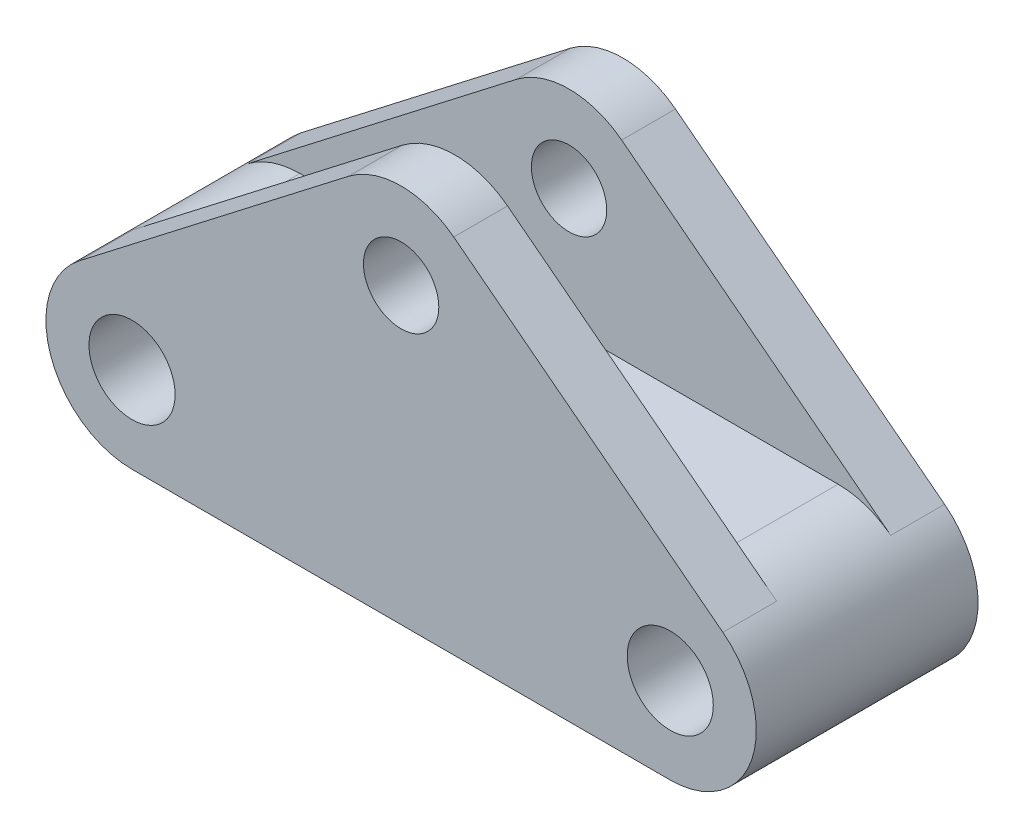
ISO-10303-21;
HEADER;
FILE_DESCRIPTION(('STEP AP214'),'2;1');
FILE_NAME('part.step','',(''),(''),'','','');
FILE_SCHEMA(('AUTOMOTIVE_DESIGN { 1 0 10303 214 1 1 1 1 }'));
ENDSEC;
DATA;
#1=APPLICATION_CONTEXT('core data for automotive mechanical design processes');
#2=APPLICATION_PROTOCOL_DEFINITION('international standard','automotive_design',2000,#1);
#3=PRODUCT_CONTEXT('',#1,'mechanical');
#4=PRODUCT('Part','Part','',(#3));
#5=PRODUCT_RELATED_PRODUCT_CATEGORY('part','',(#4));
#6=PRODUCT_DEFINITION_FORMATION('','',#4);
#7=PRODUCT_DEFINITION_CONTEXT('part definition',#1,'design');
#8=PRODUCT_DEFINITION('design','',#6,#7);
#9=PRODUCT_DEFINITION_SHAPE('','',#8);
#10=(LENGTH_UNIT() NAMED_UNIT(*) SI_UNIT(.MILLI.,.METRE.));
#11=(NAMED_UNIT(*) PLANE_ANGLE_UNIT() SI_UNIT($,.RADIAN.));
#12=(NAMED_UNIT(*) SI_UNIT($,.STERADIAN.) SOLID_ANGLE_UNIT());
#13=UNCERTAINTY_MEASURE_WITH_UNIT(LENGTH_MEASURE(1.E-05),#10,'distance_accuracy_value','');
#14=(GEOMETRIC_REPRESENTATION_CONTEXT(3) GLOBAL_UNCERTAINTY_ASSIGNED_CONTEXT((#13)) GLOBAL_UNIT_ASSIGNED_CONTEXT((#10,
#11,#12)) REPRESENTATION_CONTEXT('',''));
#15=CARTESIAN_POINT('',(0.,0.,0.));
#16=DIRECTION('',(0.,0.,1.));
#17=DIRECTION('',(1.,0.,0.));
#18=AXIS2_PLACEMENT_3D('',#15,#16,#17);
#19=CARTESIAN_POINT('',(4.88869587537191,6.33250761058537,-5.));
#20=DIRECTION('',(0.611086984421489,0.791563451323172,0.));
#21=DIRECTION('',(-0.791563451323172,0.611086984421489,0.));
#22=AXIS2_PLACEMENT_3D('',#19,#20,#21);
#23=PLANE('',#22);
#24=DIRECTION('',(-0.791563451323172,0.611086984421489,0.));
#25=VECTOR('',#24,1.);
#26=CARTESIAN_POINT('',(4.88869587537191,6.33250761058537,0.));
#27=LINE('',#26,#25);
#28=CARTESIAN_POINT('',(29.8886958753719,-12.9674923894146,0.));
#29=VERTEX_POINT('',#28);
#30=CARTESIAN_POINT('',(4.88869587537191,6.33250761058537,0.));
#31=VERTEX_POINT('',#30);
#32=EDGE_CURVE('E94',#29,#31,#27,.T.);
#33=ORIENTED_EDGE('',*,*,#32,.F.);
#34=DIRECTION('',(0.,0.,1.));
#35=VECTOR('',#34,1.);
#36=CARTESIAN_POINT('',(29.8886958753719,-12.9674923894146,-5.));
#37=LINE('',#36,#35);
#38=CARTESIAN_POINT('',(29.8886958753719,-12.9674923894146,-5.));
#39=VERTEX_POINT('',#38);
#40=EDGE_CURVE('E44',#39,#29,#37,.T.);
#41=ORIENTED_EDGE('',*,*,#40,.F.);
#42=DIRECTION('',(-0.791563451323172,0.611086984421489,0.));
#43=VECTOR('',#42,1.);
#44=CARTESIAN_POINT('',(4.88869587537191,6.33250761058537,-5.));
#45=LINE('',#44,#43);
#46=CARTESIAN_POINT('',(4.88869587537191,6.33250761058537,-5.));
#47=VERTEX_POINT('',#46);
#48=EDGE_CURVE('E121',#39,#47,#45,.T.);
#49=ORIENTED_EDGE('',*,*,#48,.T.);
#50=DIRECTION('',(0.,0.,1.));
#51=VECTOR('',#50,1.);
#52=CARTESIAN_POINT('',(4.88869587537191,6.33250761058537,-5.));
#53=LINE('',#52,#51);
#54=EDGE_CURVE('E96',#47,#31,#53,.T.);
#55=ORIENTED_EDGE('',*,*,#54,.T.);
#56=EDGE_LOOP('',(#33,#41,#49,#55));
#57=FACE_BOUND('',#56,.T.);
#58=ADVANCED_FACE('F35',(#57),#23,.T.);
#59=CARTESIAN_POINT('',(25.,-19.3,-5.));
#60=DIRECTION('',(0.,0.,1.));
#61=DIRECTION('',(1.,0.,0.));
#62=AXIS2_PLACEMENT_3D('',#59,#60,#61);
#63=CYLINDRICAL_SURFACE('',#62,8.);
#64=CARTESIAN_POINT('',(25.,-19.3,0.));
#65=DIRECTION('',(0.,0.,1.));
#66=DIRECTION('',(1.,0.,0.));
#67=AXIS2_PLACEMENT_3D('',#64,#65,#66);
#68=CIRCLE('',#67,8.);
#69=CARTESIAN_POINT('',(25.,-27.3,0.));
#70=VERTEX_POINT('',#69);
#71=EDGE_CURVE('E86',#70,#29,#68,.T.);
#72=ORIENTED_EDGE('',*,*,#71,.F.);
#73=DIRECTION('',(0.,0.,1.));
#74=VECTOR('',#73,1.);
#75=CARTESIAN_POINT('',(25.,-27.3,-5.));
#76=LINE('',#75,#74);
#77=CARTESIAN_POINT('',(25.,-27.3,-20.6));
#78=VERTEX_POINT('',#77);
#79=EDGE_CURVE('E76',#78,#70,#76,.T.);
#80=ORIENTED_EDGE('',*,*,#79,.F.);
#81=CARTESIAN_POINT('',(25.,-19.3,-20.6));
#82=DIRECTION('',(0.,0.,1.));
#83=DIRECTION('',(1.,0.,0.));
#84=AXIS2_PLACEMENT_3D('',#81,#82,#83);
#85=CIRCLE('',#84,8.);
#86=CARTESIAN_POINT('',(29.8886958753719,-12.9674923894146,-20.6));
#87=VERTEX_POINT('',#86);
#88=EDGE_CURVE('E555',#78,#87,#85,.T.);
#89=ORIENTED_EDGE('',*,*,#88,.T.);
#90=DIRECTION('',(0.,0.,1.));
#91=VECTOR('',#90,1.);
#92=CARTESIAN_POINT('',(29.8886958753719,-12.9674923894146,-20.6));
#93=LINE('',#92,#91);
#94=CARTESIAN_POINT('',(29.8886958753719,-12.9674923894146,-15.6));
#95=VERTEX_POINT('',#94);
#96=EDGE_CURVE('E161',#87,#95,#93,.T.);
#97=ORIENTED_EDGE('',*,*,#96,.T.);
#98=CARTESIAN_POINT('',(25.,-19.3,-15.6));
#99=DIRECTION('',(0.,0.,1.));
#100=DIRECTION('',(1.,0.,0.));
#101=AXIS2_PLACEMENT_3D('',#98,#99,#100);
#102=CIRCLE('',#101,8.);
#103=CARTESIAN_POINT('',(25.,-11.3,-15.6));
#104=VERTEX_POINT('',#103);
#105=EDGE_CURVE('E151',#95,#104,#102,.T.);
#106=ORIENTED_EDGE('',*,*,#105,.T.);
#107=DIRECTION('',(0.,0.,1.));
#108=VECTOR('',#107,1.);
#109=CARTESIAN_POINT('',(25.,-11.3,-15.6));
#110=LINE('',#109,#108);
#111=CARTESIAN_POINT('',(25.,-11.3,-5.));
#112=VERTEX_POINT('',#111);
#113=EDGE_CURVE('E149',#104,#112,#110,.T.);
#114=ORIENTED_EDGE('',*,*,#113,.T.);
#115=CARTESIAN_POINT('',(25.,-19.3,-5.));
#116=DIRECTION('',(0.,0.,1.));
#117=DIRECTION('',(1.,0.,0.));
#118=AXIS2_PLACEMENT_3D('',#115,#116,#117);
#119=CIRCLE('',#118,8.);
#120=EDGE_CURVE('E11',#39,#112,#119,.T.);
#121=ORIENTED_EDGE('',*,*,#120,.F.);
#122=ORIENTED_EDGE('',*,*,#40,.T.);
#123=EDGE_LOOP('',(#72,#80,#89,#97,#106,#114,#121,#122));
#124=FACE_BOUND('',#123,.T.);
#125=ADVANCED_FACE('F84',(#124),#63,.T.);
#126=CARTESIAN_POINT('',(0.,-27.3,-5.));
#127=DIRECTION('',(0.,1.,0.));
#128=DIRECTION('',(0.,0.,1.));
#129=AXIS2_PLACEMENT_3D('',#126,#127,#128);
#130=PLANE('',#129);
#131=DIRECTION('',(-1.,0.,0.));
#132=VECTOR('',#131,1.);
#133=CARTESIAN_POINT('',(0.,-27.3,0.));
#134=LINE('',#133,#132);
#135=CARTESIAN_POINT('',(-25.,-27.3,0.));
#136=VERTEX_POINT('',#135);
#137=EDGE_CURVE('E106',#70,#136,#134,.T.);
#138=ORIENTED_EDGE('',*,*,#137,.T.);
#139=DIRECTION('',(0.,0.,1.));
#140=VECTOR('',#139,1.);
#141=CARTESIAN_POINT('',(-25.,-27.3,-5.));
#142=LINE('',#141,#140);
#143=CARTESIAN_POINT('',(-25.,-27.3,-20.6));
#144=VERTEX_POINT('',#143);
#145=EDGE_CURVE('E123',#144,#136,#142,.T.);
#146=ORIENTED_EDGE('',*,*,#145,.F.);
#147=DIRECTION('',(-1.,0.,0.));
#148=VECTOR('',#147,1.);
#149=CARTESIAN_POINT('',(0.,-27.3,-20.6));
#150=LINE('',#149,#148);
#151=EDGE_CURVE('E549',#78,#144,#150,.T.);
#152=ORIENTED_EDGE('',*,*,#151,.F.);
#153=ORIENTED_EDGE('',*,*,#79,.T.);
#154=EDGE_LOOP('',(#138,#146,#152,#153));
#155=FACE_BOUND('',#154,.T.);
#156=ADVANCED_FACE('F184',(#155),#130,.F.);
#157=CARTESIAN_POINT('',(-25.,-19.3,-5.));
#158=DIRECTION('',(0.,0.,1.));
#159=DIRECTION('',(1.,0.,0.));
#160=AXIS2_PLACEMENT_3D('',#157,#158,#159);
#161=CYLINDRICAL_SURFACE('',#160,8.);
#162=CARTESIAN_POINT('',(-25.,-19.3,0.));
#163=DIRECTION('',(0.,0.,1.));
#164=DIRECTION('',(1.,0.,0.));
#165=AXIS2_PLACEMENT_3D('',#162,#163,#164);
#166=CIRCLE('',#165,8.);
#167=CARTESIAN_POINT('',(-29.8886958753719,-12.9674923894146,0.));
#168=VERTEX_POINT('',#167);
#169=EDGE_CURVE('E112',#168,#136,#166,.T.);
#170=ORIENTED_EDGE('',*,*,#169,.F.);
#171=DIRECTION('',(0.,0.,1.));
#172=VECTOR('',#171,1.);
#173=CARTESIAN_POINT('',(-29.8886958753719,-12.9674923894146,-5.));
#174=LINE('',#173,#172);
#175=CARTESIAN_POINT('',(-29.8886958753719,-12.9674923894146,-5.));
#176=VERTEX_POINT('',#175);
#177=EDGE_CURVE('E125',#176,#168,#174,.T.);
#178=ORIENTED_EDGE('',*,*,#177,.F.);
#179=CARTESIAN_POINT('',(-25.,-19.3,-5.));
#180=DIRECTION('',(0.,0.,1.));
#181=DIRECTION('',(1.,0.,0.));
#182=AXIS2_PLACEMENT_3D('',#179,#180,#181);
#183=CIRCLE('',#182,8.);
#184=CARTESIAN_POINT('',(-25.,-11.3,-5.));
#185=VERTEX_POINT('',#184);
#186=EDGE_CURVE('E160',#185,#176,#183,.T.);
#187=ORIENTED_EDGE('',*,*,#186,.F.);
#188=DIRECTION('',(0.,0.,1.));
#189=VECTOR('',#188,1.);
#190=CARTESIAN_POINT('',(-25.,-11.3,-15.6));
#191=LINE('',#190,#189);
#192=CARTESIAN_POINT('',(-25.,-11.3,-15.6));
#193=VERTEX_POINT('',#192);
#194=EDGE_CURVE('E101',#193,#185,#191,.T.);
#195=ORIENTED_EDGE('',*,*,#194,.F.);
#196=CARTESIAN_POINT('',(-25.,-19.3,-15.6));
#197=DIRECTION('',(0.,0.,1.));
#198=DIRECTION('',(1.,0.,0.));
#199=AXIS2_PLACEMENT_3D('',#196,#197,#198);
#200=CIRCLE('',#199,8.);
#201=CARTESIAN_POINT('',(-29.8886958753719,-12.9674923894146,-15.6));
#202=VERTEX_POINT('',#201);
#203=EDGE_CURVE('E145',#193,#202,#200,.T.);
#204=ORIENTED_EDGE('',*,*,#203,.T.);
#205=DIRECTION('',(0.,0.,1.));
#206=VECTOR('',#205,1.);
#207=CARTESIAN_POINT('',(-29.8886958753719,-12.9674923894146,-20.6));
#208=LINE('',#207,#206);
#209=CARTESIAN_POINT('',(-29.8886958753719,-12.9674923894146,-20.6));
#210=VERTEX_POINT('',#209);
#211=EDGE_CURVE('E382',#210,#202,#208,.T.);
#212=ORIENTED_EDGE('',*,*,#211,.F.);
#213=CARTESIAN_POINT('',(-25.,-19.3,-20.6));
#214=DIRECTION('',(0.,0.,1.));
#215=DIRECTION('',(1.,0.,0.));
#216=AXIS2_PLACEMENT_3D('',#213,#214,#215);
#217=CIRCLE('',#216,8.);
#218=EDGE_CURVE('E182',#210,#144,#217,.T.);
#219=ORIENTED_EDGE('',*,*,#218,.T.);
#220=ORIENTED_EDGE('',*,*,#145,.T.);
#221=EDGE_LOOP('',(#170,#178,#187,#195,#204,#212,#219,#220));
#222=FACE_BOUND('',#221,.T.);
#223=ADVANCED_FACE('F175',(#222),#161,.T.);
#224=CARTESIAN_POINT('',(-4.88869587537191,6.33250761058537,-5.));
#225=DIRECTION('',(0.611086984421489,-0.791563451323172,0.));
#226=DIRECTION('',(0.791563451323172,0.611086984421489,0.));
#227=AXIS2_PLACEMENT_3D('',#224,#225,#226);
#228=PLANE('',#227);
#229=DIRECTION('',(0.791563451323172,0.611086984421489,0.));
#230=VECTOR('',#229,1.);
#231=CARTESIAN_POINT('',(-4.88869587537191,6.33250761058537,0.));
#232=LINE('',#231,#230);
#233=CARTESIAN_POINT('',(-4.88869587537191,6.33250761058537,0.));
#234=VERTEX_POINT('',#233);
#235=EDGE_CURVE('E170',#168,#234,#232,.T.);
#236=ORIENTED_EDGE('',*,*,#235,.T.);
#237=DIRECTION('',(0.,0.,1.));
#238=VECTOR('',#237,1.);
#239=CARTESIAN_POINT('',(-4.88869587537191,6.33250761058537,-5.));
#240=LINE('',#239,#238);
#241=CARTESIAN_POINT('',(-4.88869587537191,6.33250761058537,-5.));
#242=VERTEX_POINT('',#241);
#243=EDGE_CURVE('E126',#242,#234,#240,.T.);
#244=ORIENTED_EDGE('',*,*,#243,.F.);
#245=DIRECTION('',(0.791563451323172,0.611086984421489,0.));
#246=VECTOR('',#245,1.);
#247=CARTESIAN_POINT('',(-4.88869587537191,6.33250761058537,-5.));
#248=LINE('',#247,#246);
#249=EDGE_CURVE('E53',#176,#242,#248,.T.);
#250=ORIENTED_EDGE('',*,*,#249,.F.);
#251=ORIENTED_EDGE('',*,*,#177,.T.);
#252=EDGE_LOOP('',(#236,#244,#250,#251));
#253=FACE_BOUND('',#252,.T.);
#254=ADVANCED_FACE('F191',(#253),#228,.F.);
#255=CARTESIAN_POINT('',(-25.,-19.3,-5.));
#256=DIRECTION('',(0.,0.,1.));
#257=DIRECTION('',(1.,0.,0.));
#258=AXIS2_PLACEMENT_3D('',#255,#256,#257);
#259=CYLINDRICAL_SURFACE('',#258,4.);
#260=CARTESIAN_POINT('',(-25.,-19.3,0.));
#261=DIRECTION('',(0.,0.,1.));
#262=DIRECTION('',(1.,0.,0.));
#263=AXIS2_PLACEMENT_3D('',#260,#261,#262);
#264=CIRCLE('',#263,4.);
#265=CARTESIAN_POINT('',(-21.,-19.3,0.));
#266=VERTEX_POINT('',#265);
#267=EDGE_CURVE('E110',#266,#266,#264,.T.);
#268=ORIENTED_EDGE('',*,*,#267,.T.);
#269=EDGE_LOOP('',(#268));
#270=FACE_BOUND('',#269,.T.);
#271=CARTESIAN_POINT('',(-25.,-19.3,-20.6));
#272=DIRECTION('',(0.,0.,1.));
#273=DIRECTION('',(1.,0.,0.));
#274=AXIS2_PLACEMENT_3D('',#271,#272,#273);
#275=CIRCLE('',#274,4.);
#276=CARTESIAN_POINT('',(-21.,-19.3,-20.6));
#277=VERTEX_POINT('',#276);
#278=EDGE_CURVE('E362',#277,#277,#275,.T.);
#279=ORIENTED_EDGE('',*,*,#278,.F.);
#280=EDGE_LOOP('',(#279));
#281=FACE_BOUND('',#280,.T.);
#282=ADVANCED_FACE('F228',(#270,#281),#259,.F.);
#283=CARTESIAN_POINT('',(0.,0.,-5.));
#284=DIRECTION('',(0.,0.,1.));
#285=DIRECTION('',(1.,0.,0.));
#286=AXIS2_PLACEMENT_3D('',#283,#284,#285);
#287=CYLINDRICAL_SURFACE('',#286,3.5);
#288=CARTESIAN_POINT('',(0.,0.,-5.));
#289=DIRECTION('',(0.,0.,1.));
#290=DIRECTION('',(1.,0.,0.));
#291=AXIS2_PLACEMENT_3D('',#288,#289,#290);
#292=CIRCLE('',#291,3.5);
#293=CARTESIAN_POINT('',(3.5,0.,-5.));
#294=VERTEX_POINT('',#293);
#295=EDGE_CURVE('E130',#294,#294,#292,.T.);
#296=ORIENTED_EDGE('',*,*,#295,.F.);
#297=EDGE_LOOP('',(#296));
#298=FACE_BOUND('',#297,.T.);
#299=CARTESIAN_POINT('',(0.,0.,0.));
#300=DIRECTION('',(0.,0.,1.));
#301=DIRECTION('',(1.,0.,0.));
#302=AXIS2_PLACEMENT_3D('',#299,#300,#301);
#303=CIRCLE('',#302,3.5);
#304=CARTESIAN_POINT('',(3.5,0.,0.));
#305=VERTEX_POINT('',#304);
#306=EDGE_CURVE('E107',#305,#305,#303,.T.);
#307=ORIENTED_EDGE('',*,*,#306,.T.);
#308=EDGE_LOOP('',(#307));
#309=FACE_BOUND('',#308,.T.);
#310=ADVANCED_FACE('F232',(#298,#309),#287,.F.);
#311=CARTESIAN_POINT('',(0.,0.,-5.));
#312=DIRECTION('',(0.,0.,1.));
#313=DIRECTION('',(1.,0.,0.));
#314=AXIS2_PLACEMENT_3D('',#311,#312,#313);
#315=CYLINDRICAL_SURFACE('',#314,8.);
#316=CARTESIAN_POINT('',(0.,0.,0.));
#317=DIRECTION('',(0.,0.,1.));
#318=DIRECTION('',(1.,0.,0.));
#319=AXIS2_PLACEMENT_3D('',#316,#317,#318);
#320=CIRCLE('',#319,8.);
#321=EDGE_CURVE('E100',#234,#31,#320,.F.);
#322=ORIENTED_EDGE('',*,*,#321,.T.);
#323=ORIENTED_EDGE('',*,*,#54,.F.);
#324=CARTESIAN_POINT('',(0.,0.,-5.));
#325=DIRECTION('',(0.,0.,1.));
#326=DIRECTION('',(1.,0.,0.));
#327=AXIS2_PLACEMENT_3D('',#324,#325,#326);
#328=CIRCLE('',#327,8.);
#329=EDGE_CURVE('E142',#242,#47,#328,.F.);
#330=ORIENTED_EDGE('',*,*,#329,.F.);
#331=ORIENTED_EDGE('',*,*,#243,.T.);
#332=EDGE_LOOP('',(#322,#323,#330,#331));
#333=FACE_BOUND('',#332,.T.);
#334=ADVANCED_FACE('F245',(#333),#315,.T.);
#335=CARTESIAN_POINT('',(25.,-19.3,-5.));
#336=DIRECTION('',(0.,0.,1.));
#337=DIRECTION('',(1.,0.,0.));
#338=AXIS2_PLACEMENT_3D('',#335,#336,#337);
#339=CYLINDRICAL_SURFACE('',#338,4.);
#340=CARTESIAN_POINT('',(25.,-19.3,0.));
#341=DIRECTION('',(0.,0.,1.));
#342=DIRECTION('',(1.,0.,0.));
#343=AXIS2_PLACEMENT_3D('',#340,#341,#342);
#344=CIRCLE('',#343,4.);
#345=CARTESIAN_POINT('',(29.,-19.3,0.));
#346=VERTEX_POINT('',#345);
#347=EDGE_CURVE('E118',#346,#346,#344,.F.);
#348=ORIENTED_EDGE('',*,*,#347,.F.);
#349=EDGE_LOOP('',(#348));
#350=FACE_BOUND('',#349,.T.);
#351=CARTESIAN_POINT('',(25.,-19.3,-20.6));
#352=DIRECTION('',(0.,0.,1.));
#353=DIRECTION('',(1.,0.,0.));
#354=AXIS2_PLACEMENT_3D('',#351,#352,#353);
#355=CIRCLE('',#354,4.);
#356=CARTESIAN_POINT('',(29.,-19.3,-20.6));
#357=VERTEX_POINT('',#356);
#358=EDGE_CURVE('E359',#357,#357,#355,.F.);
#359=ORIENTED_EDGE('',*,*,#358,.T.);
#360=EDGE_LOOP('',(#359));
#361=FACE_BOUND('',#360,.T.);
#362=ADVANCED_FACE('F241',(#350,#361),#339,.F.);
#363=CARTESIAN_POINT('',(0.,0.,-5.));
#364=DIRECTION('',(0.,0.,1.));
#365=DIRECTION('',(1.,0.,0.));
#366=AXIS2_PLACEMENT_3D('',#363,#364,#365);
#367=PLANE('',#366);
#368=ORIENTED_EDGE('',*,*,#48,.F.);
#369=ORIENTED_EDGE('',*,*,#120,.T.);
#370=DIRECTION('',(1.,0.,0.));
#371=VECTOR('',#370,1.);
#372=CARTESIAN_POINT('',(0.,-11.3,-5.));
#373=LINE('',#372,#371);
#374=EDGE_CURVE('E157',#185,#112,#373,.T.);
#375=ORIENTED_EDGE('',*,*,#374,.F.);
#376=ORIENTED_EDGE('',*,*,#186,.T.);
#377=ORIENTED_EDGE('',*,*,#249,.T.);
#378=ORIENTED_EDGE('',*,*,#329,.T.);
#379=EDGE_LOOP('',(#368,#369,#375,#376,#377,#378));
#380=FACE_BOUND('',#379,.T.);
#381=ORIENTED_EDGE('',*,*,#295,.T.);
#382=EDGE_LOOP('',(#381));
#383=FACE_BOUND('',#382,.T.);
#384=ADVANCED_FACE('F210',(#380,#383),#367,.F.);
#385=CARTESIAN_POINT('',(0.,0.,0.));
#386=DIRECTION('',(0.,0.,1.));
#387=DIRECTION('',(1.,0.,0.));
#388=AXIS2_PLACEMENT_3D('',#385,#386,#387);
#389=PLANE('',#388);
#390=ORIENTED_EDGE('',*,*,#32,.T.);
#391=ORIENTED_EDGE('',*,*,#321,.F.);
#392=ORIENTED_EDGE('',*,*,#235,.F.);
#393=ORIENTED_EDGE('',*,*,#169,.T.);
#394=ORIENTED_EDGE('',*,*,#137,.F.);
#395=ORIENTED_EDGE('',*,*,#71,.T.);
#396=EDGE_LOOP('',(#390,#391,#392,#393,#394,#395));
#397=FACE_BOUND('',#396,.T.);
#398=ORIENTED_EDGE('',*,*,#306,.F.);
#399=EDGE_LOOP('',(#398));
#400=FACE_BOUND('',#399,.T.);
#401=ORIENTED_EDGE('',*,*,#267,.F.);
#402=EDGE_LOOP('',(#401));
#403=FACE_BOUND('',#402,.T.);
#404=ORIENTED_EDGE('',*,*,#347,.T.);
#405=EDGE_LOOP('',(#404));
#406=FACE_BOUND('',#405,.T.);
#407=ADVANCED_FACE('F103',(#397,#400,#403,#406),#389,.T.);
#408=CARTESIAN_POINT('',(0.,-11.3,-15.6));
#409=DIRECTION('',(0.,-1.,0.));
#410=DIRECTION('',(0.,0.,-1.));
#411=AXIS2_PLACEMENT_3D('',#408,#409,#410);
#412=PLANE('',#411);
#413=ORIENTED_EDGE('',*,*,#374,.T.);
#414=ORIENTED_EDGE('',*,*,#113,.F.);
#415=DIRECTION('',(1.,0.,0.));
#416=VECTOR('',#415,1.);
#417=CARTESIAN_POINT('',(0.,-11.3,-15.6));
#418=LINE('',#417,#416);
#419=EDGE_CURVE('E150',#193,#104,#418,.T.);
#420=ORIENTED_EDGE('',*,*,#419,.F.);
#421=ORIENTED_EDGE('',*,*,#194,.T.);
#422=EDGE_LOOP('',(#413,#414,#420,#421));
#423=FACE_BOUND('',#422,.T.);
#424=ADVANCED_FACE('F254',(#423),#412,.F.);
#425=CARTESIAN_POINT('',(0.,0.,-15.6));
#426=DIRECTION('',(0.,0.,1.));
#427=DIRECTION('',(1.,0.,0.));
#428=AXIS2_PLACEMENT_3D('',#425,#426,#427);
#429=PLANE('',#428);
#430=CARTESIAN_POINT('',(0.,0.,-15.6));
#431=DIRECTION('',(0.,0.,1.));
#432=DIRECTION('',(1.,0.,0.));
#433=AXIS2_PLACEMENT_3D('',#430,#431,#432);
#434=CIRCLE('',#433,3.5);
#435=CARTESIAN_POINT('',(3.5,0.,-15.6));
#436=VERTEX_POINT('',#435);
#437=EDGE_CURVE('E377',#436,#436,#434,.T.);
#438=ORIENTED_EDGE('',*,*,#437,.F.);
#439=EDGE_LOOP('',(#438));
#440=FACE_BOUND('',#439,.T.);
#441=ORIENTED_EDGE('',*,*,#203,.F.);
#442=ORIENTED_EDGE('',*,*,#419,.T.);
#443=ORIENTED_EDGE('',*,*,#105,.F.);
#444=DIRECTION('',(-0.791563451323172,0.611086984421489,0.));
#445=VECTOR('',#444,1.);
#446=CARTESIAN_POINT('',(4.88869587537191,6.33250761058537,-15.6));
#447=LINE('',#446,#445);
#448=CARTESIAN_POINT('',(4.88869587537191,6.33250761058537,-15.6));
#449=VERTEX_POINT('',#448);
#450=EDGE_CURVE('E376',#95,#449,#447,.T.);
#451=ORIENTED_EDGE('',*,*,#450,.T.);
#452=CARTESIAN_POINT('',(0.,0.,-15.6));
#453=DIRECTION('',(0.,0.,1.));
#454=DIRECTION('',(1.,0.,0.));
#455=AXIS2_PLACEMENT_3D('',#452,#453,#454);
#456=CIRCLE('',#455,8.);
#457=CARTESIAN_POINT('',(-4.88869587537191,6.33250761058537,-15.6));
#458=VERTEX_POINT('',#457);
#459=EDGE_CURVE('E372',#458,#449,#456,.F.);
#460=ORIENTED_EDGE('',*,*,#459,.F.);
#461=DIRECTION('',(0.791563451323172,0.611086984421489,0.));
#462=VECTOR('',#461,1.);
#463=CARTESIAN_POINT('',(-4.88869587537191,6.33250761058537,-15.6));
#464=LINE('',#463,#462);
#465=EDGE_CURVE('E375',#202,#458,#464,.T.);
#466=ORIENTED_EDGE('',*,*,#465,.F.);
#467=EDGE_LOOP('',(#441,#442,#443,#451,#460,#466));
#468=FACE_BOUND('',#467,.T.);
#469=ADVANCED_FACE('F259',(#440,#468),#429,.T.);
#470=CARTESIAN_POINT('',(4.88869587537191,6.33250761058537,-20.6));
#471=DIRECTION('',(0.611086984421489,0.791563451323172,0.));
#472=DIRECTION('',(-0.791563451323172,0.611086984421489,0.));
#473=AXIS2_PLACEMENT_3D('',#470,#471,#472);
#474=PLANE('',#473);
#475=ORIENTED_EDGE('',*,*,#450,.F.);
#476=ORIENTED_EDGE('',*,*,#96,.F.);
#477=DIRECTION('',(-0.791563451323172,0.611086984421489,0.));
#478=VECTOR('',#477,1.);
#479=CARTESIAN_POINT('',(4.88869587537191,6.33250761058537,-20.6));
#480=LINE('',#479,#478);
#481=CARTESIAN_POINT('',(4.88869587537191,6.33250761058537,-20.6));
#482=VERTEX_POINT('',#481);
#483=EDGE_CURVE('E380',#87,#482,#480,.T.);
#484=ORIENTED_EDGE('',*,*,#483,.T.);
#485=DIRECTION('',(0.,0.,1.));
#486=VECTOR('',#485,1.);
#487=CARTESIAN_POINT('',(4.88869587537191,6.33250761058537,-20.6));
#488=LINE('',#487,#486);
#489=EDGE_CURVE('E361',#482,#449,#488,.T.);
#490=ORIENTED_EDGE('',*,*,#489,.T.);
#491=EDGE_LOOP('',(#475,#476,#484,#490));
#492=FACE_BOUND('',#491,.T.);
#493=ADVANCED_FACE('F270',(#492),#474,.T.);
#494=CARTESIAN_POINT('',(-4.88869587537191,6.33250761058537,-20.6));
#495=DIRECTION('',(0.611086984421489,-0.791563451323172,0.));
#496=DIRECTION('',(0.791563451323172,0.611086984421489,0.));
#497=AXIS2_PLACEMENT_3D('',#494,#495,#496);
#498=PLANE('',#497);
#499=ORIENTED_EDGE('',*,*,#465,.T.);
#500=DIRECTION('',(0.,0.,1.));
#501=VECTOR('',#500,1.);
#502=CARTESIAN_POINT('',(-4.88869587537191,6.33250761058537,-20.6));
#503=LINE('',#502,#501);
#504=CARTESIAN_POINT('',(-4.88869587537191,6.33250761058537,-20.6));
#505=VERTEX_POINT('',#504);
#506=EDGE_CURVE('E365',#505,#458,#503,.T.);
#507=ORIENTED_EDGE('',*,*,#506,.F.);
#508=DIRECTION('',(0.791563451323172,0.611086984421489,0.));
#509=VECTOR('',#508,1.);
#510=CARTESIAN_POINT('',(-4.88869587537191,6.33250761058537,-20.6));
#511=LINE('',#510,#509);
#512=EDGE_CURVE('E545',#210,#505,#511,.T.);
#513=ORIENTED_EDGE('',*,*,#512,.F.);
#514=ORIENTED_EDGE('',*,*,#211,.T.);
#515=EDGE_LOOP('',(#499,#507,#513,#514));
#516=FACE_BOUND('',#515,.T.);
#517=ADVANCED_FACE('F281',(#516),#498,.F.);
#518=CARTESIAN_POINT('',(0.,0.,-20.6));
#519=DIRECTION('',(0.,0.,1.));
#520=DIRECTION('',(1.,0.,0.));
#521=AXIS2_PLACEMENT_3D('',#518,#519,#520);
#522=CYLINDRICAL_SURFACE('',#521,3.5);
#523=CARTESIAN_POINT('',(0.,0.,-20.6));
#524=DIRECTION('',(0.,0.,1.));
#525=DIRECTION('',(1.,0.,0.));
#526=AXIS2_PLACEMENT_3D('',#523,#524,#525);
#527=CIRCLE('',#526,3.5);
#528=CARTESIAN_POINT('',(3.5,0.,-20.6));
#529=VERTEX_POINT('',#528);
#530=EDGE_CURVE('E368',#529,#529,#527,.T.);
#531=ORIENTED_EDGE('',*,*,#530,.F.);
#532=EDGE_LOOP('',(#531));
#533=FACE_BOUND('',#532,.T.);
#534=ORIENTED_EDGE('',*,*,#437,.T.);
#535=EDGE_LOOP('',(#534));
#536=FACE_BOUND('',#535,.T.);
#537=ADVANCED_FACE('F291',(#533,#536),#522,.F.);
#538=CARTESIAN_POINT('',(0.,0.,-20.6));
#539=DIRECTION('',(0.,0.,1.));
#540=DIRECTION('',(1.,0.,0.));
#541=AXIS2_PLACEMENT_3D('',#538,#539,#540);
#542=CYLINDRICAL_SURFACE('',#541,8.);
#543=ORIENTED_EDGE('',*,*,#459,.T.);
#544=ORIENTED_EDGE('',*,*,#489,.F.);
#545=CARTESIAN_POINT('',(0.,0.,-20.6));
#546=DIRECTION('',(0.,0.,1.));
#547=DIRECTION('',(1.,0.,0.));
#548=AXIS2_PLACEMENT_3D('',#545,#546,#547);
#549=CIRCLE('',#548,8.);
#550=EDGE_CURVE('E546',#505,#482,#549,.F.);
#551=ORIENTED_EDGE('',*,*,#550,.F.);
#552=ORIENTED_EDGE('',*,*,#506,.T.);
#553=EDGE_LOOP('',(#543,#544,#551,#552));
#554=FACE_BOUND('',#553,.T.);
#555=ADVANCED_FACE('F301',(#554),#542,.T.);
#556=CARTESIAN_POINT('',(0.,0.,-20.6));
#557=DIRECTION('',(0.,0.,1.));
#558=DIRECTION('',(1.,0.,0.));
#559=AXIS2_PLACEMENT_3D('',#556,#557,#558);
#560=PLANE('',#559);
#561=ORIENTED_EDGE('',*,*,#483,.F.);
#562=ORIENTED_EDGE('',*,*,#88,.F.);
#563=ORIENTED_EDGE('',*,*,#151,.T.);
#564=ORIENTED_EDGE('',*,*,#218,.F.);
#565=ORIENTED_EDGE('',*,*,#512,.T.);
#566=ORIENTED_EDGE('',*,*,#550,.T.);
#567=EDGE_LOOP('',(#561,#562,#563,#564,#565,#566));
#568=FACE_BOUND('',#567,.T.);
#569=ORIENTED_EDGE('',*,*,#530,.T.);
#570=EDGE_LOOP('',(#569));
#571=FACE_BOUND('',#570,.T.);
#572=ORIENTED_EDGE('',*,*,#278,.T.);
#573=EDGE_LOOP('',(#572));
#574=FACE_BOUND('',#573,.T.);
#575=ORIENTED_EDGE('',*,*,#358,.F.);
#576=EDGE_LOOP('',(#575));
#577=FACE_BOUND('',#576,.T.);
#578=ADVANCED_FACE('F311',(#568,#571,#574,#577),#560,.F.);
#579=CLOSED_SHELL('',(#58,#125,#156,#223,#254,#282,#310,#334,#362,#384,#407,#424,#469,#493,#517,
#537,#555,#578));
#580=MANIFOLD_SOLID_BREP('B2',#579);
#581=ADVANCED_BREP_SHAPE_REPRESENTATION('',(#18,#580),#14);
#582=SHAPE_DEFINITION_REPRESENTATION(#9,#581);
ENDSEC;
END-ISO-10303-21;
